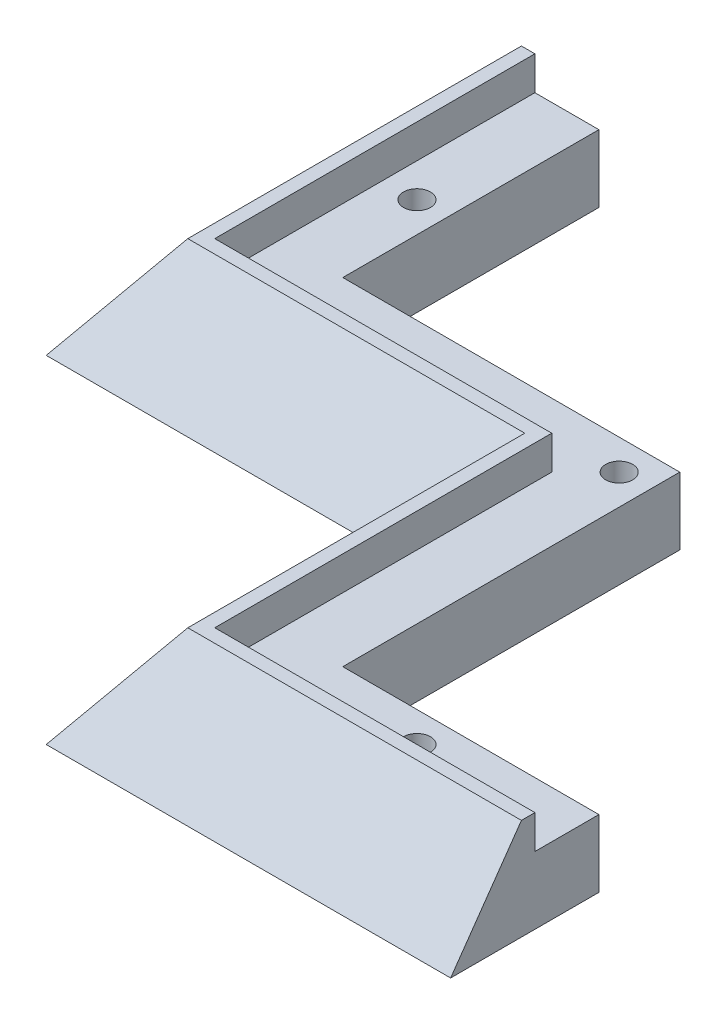
ISO-10303-21;
HEADER;
FILE_DESCRIPTION(('STEP AP214'),'2;1');
FILE_NAME('part.step','',(''),(''),'','','');
FILE_SCHEMA(('AUTOMOTIVE_DESIGN { 1 0 10303 214 1 1 1 1 }'));
ENDSEC;
DATA;
#1=APPLICATION_CONTEXT('core data for automotive mechanical design processes');
#2=APPLICATION_PROTOCOL_DEFINITION('international standard','automotive_design',2000,#1);
#3=PRODUCT_CONTEXT('',#1,'mechanical');
#4=PRODUCT('Part','Part','',(#3));
#5=PRODUCT_RELATED_PRODUCT_CATEGORY('part','',(#4));
#6=PRODUCT_DEFINITION_FORMATION('','',#4);
#7=PRODUCT_DEFINITION_CONTEXT('part definition',#1,'design');
#8=PRODUCT_DEFINITION('design','',#6,#7);
#9=PRODUCT_DEFINITION_SHAPE('','',#8);
#10=(LENGTH_UNIT() NAMED_UNIT(*) SI_UNIT(.MILLI.,.METRE.));
#11=(NAMED_UNIT(*) PLANE_ANGLE_UNIT() SI_UNIT($,.RADIAN.));
#12=(NAMED_UNIT(*) SI_UNIT($,.STERADIAN.) SOLID_ANGLE_UNIT());
#13=UNCERTAINTY_MEASURE_WITH_UNIT(LENGTH_MEASURE(1.E-05),#10,'distance_accuracy_value','');
#14=(GEOMETRIC_REPRESENTATION_CONTEXT(3) GLOBAL_UNCERTAINTY_ASSIGNED_CONTEXT((#13)) GLOBAL_UNIT_ASSIGNED_CONTEXT((#10,
#11,#12)) REPRESENTATION_CONTEXT('',''));
#15=CARTESIAN_POINT('',(0.,0.,0.));
#16=DIRECTION('',(0.,0.,1.));
#17=DIRECTION('',(1.,0.,0.));
#18=AXIS2_PLACEMENT_3D('',#15,#16,#17);
#19=CARTESIAN_POINT('',(68.6476510887299,15.,68.6476510887299));
#20=DIRECTION('',(-1.,0.,0.));
#21=DIRECTION('',(0.,0.,1.));
#22=AXIS2_PLACEMENT_3D('',#19,#20,#21);
#23=PLANE('',#22);
#24=DIRECTION('',(0.,0.,-1.));
#25=VECTOR('',#24,1.);
#26=CARTESIAN_POINT('',(68.6476510887299,10.,46.6476510887299));
#27=LINE('',#26,#25);
#28=CARTESIAN_POINT('',(68.6476510887299,10.,56.1403822311179));
#29=VERTEX_POINT('',#28);
#30=CARTESIAN_POINT('',(68.6476510887299,10.,46.6476510887299));
#31=VERTEX_POINT('',#30);
#32=EDGE_CURVE('E178',#29,#31,#27,.T.);
#33=ORIENTED_EDGE('',*,*,#32,.F.);
#34=DIRECTION('',(0.,1.,0.));
#35=VECTOR('',#34,1.);
#36=CARTESIAN_POINT('',(68.6476510887299,10.,56.1403822311179));
#37=LINE('',#36,#35);
#38=CARTESIAN_POINT('',(68.6476510887299,15.,56.1403822311179));
#39=VERTEX_POINT('',#38);
#40=EDGE_CURVE('E198',#29,#39,#37,.T.);
#41=ORIENTED_EDGE('',*,*,#40,.T.);
#42=DIRECTION('',(0.,0.,-1.));
#43=VECTOR('',#42,1.);
#44=CARTESIAN_POINT('',(68.6476510887299,15.,68.6476510887299));
#45=LINE('',#44,#43);
#46=CARTESIAN_POINT('',(68.6476510887299,15.,58.1445380155843));
#47=VERTEX_POINT('',#46);
#48=EDGE_CURVE('E222',#47,#39,#45,.T.);
#49=ORIENTED_EDGE('',*,*,#48,.F.);
#50=DIRECTION('',(0.,-0.819152044288993,0.573576436351045));
#51=VECTOR('',#50,1.);
#52=CARTESIAN_POINT('',(68.6476510887299,15.,58.1445380155843));
#53=LINE('',#52,#51);
#54=CARTESIAN_POINT('',(68.6476510887299,0.,68.6476510887299));
#55=VERTEX_POINT('',#54);
#56=EDGE_CURVE('E45',#47,#55,#53,.T.);
#57=ORIENTED_EDGE('',*,*,#56,.T.);
#58=DIRECTION('',(0.,0.,-1.));
#59=VECTOR('',#58,1.);
#60=CARTESIAN_POINT('',(68.6476510887299,0.,68.6476510887299));
#61=LINE('',#60,#59);
#62=CARTESIAN_POINT('',(68.6476510887299,0.,46.6476510887299));
#63=VERTEX_POINT('',#62);
#64=EDGE_CURVE('E241',#55,#63,#61,.T.);
#65=ORIENTED_EDGE('',*,*,#64,.T.);
#66=DIRECTION('',(0.,-1.,0.));
#67=VECTOR('',#66,1.);
#68=CARTESIAN_POINT('',(68.6476510887299,15.,46.6476510887299));
#69=LINE('',#68,#67);
#70=EDGE_CURVE('E264',#31,#63,#69,.T.);
#71=ORIENTED_EDGE('',*,*,#70,.F.);
#72=EDGE_LOOP('',(#33,#41,#49,#57,#65,#71));
#73=FACE_BOUND('',#72,.T.);
#74=ADVANCED_FACE('F35',(#73),#23,.F.);
#75=CARTESIAN_POINT('',(30.6476510887299,15.,46.6476510887299));
#76=DIRECTION('',(0.,0.,1.));
#77=DIRECTION('',(1.,0.,0.));
#78=AXIS2_PLACEMENT_3D('',#75,#76,#77);
#79=PLANE('',#78);
#80=DIRECTION('',(0.,-1.,0.));
#81=VECTOR('',#80,1.);
#82=CARTESIAN_POINT('',(30.6476510887299,15.,46.6476510887299));
#83=LINE('',#82,#81);
#84=CARTESIAN_POINT('',(30.6476510887299,10.,46.6476510887299));
#85=VERTEX_POINT('',#84);
#86=CARTESIAN_POINT('',(30.6476510887299,0.,46.6476510887299));
#87=VERTEX_POINT('',#86);
#88=EDGE_CURVE('E262',#85,#87,#83,.T.);
#89=ORIENTED_EDGE('',*,*,#88,.F.);
#90=DIRECTION('',(-1.,0.,0.));
#91=VECTOR('',#90,1.);
#92=CARTESIAN_POINT('',(30.6476510887299,10.,46.6476510887299));
#93=LINE('',#92,#91);
#94=EDGE_CURVE('E180',#31,#85,#93,.T.);
#95=ORIENTED_EDGE('',*,*,#94,.F.);
#96=ORIENTED_EDGE('',*,*,#70,.T.);
#97=DIRECTION('',(-1.,0.,0.));
#98=VECTOR('',#97,1.);
#99=CARTESIAN_POINT('',(30.6476510887299,0.,46.6476510887299));
#100=LINE('',#99,#98);
#101=EDGE_CURVE('E244',#63,#87,#100,.T.);
#102=ORIENTED_EDGE('',*,*,#101,.T.);
#103=EDGE_LOOP('',(#89,#95,#96,#102));
#104=FACE_BOUND('',#103,.T.);
#105=ADVANCED_FACE('F330',(#104),#79,.F.);
#106=CARTESIAN_POINT('',(30.6476510887299,15.,-3.3523489112701));
#107=DIRECTION('',(-1.,0.,0.));
#108=DIRECTION('',(0.,0.,1.));
#109=AXIS2_PLACEMENT_3D('',#106,#107,#108);
#110=PLANE('',#109);
#111=DIRECTION('',(0.,-1.,0.));
#112=VECTOR('',#111,1.);
#113=CARTESIAN_POINT('',(30.6476510887299,15.,-3.3523489112701));
#114=LINE('',#113,#112);
#115=CARTESIAN_POINT('',(30.6476510887299,10.,-3.3523489112701));
#116=VERTEX_POINT('',#115);
#117=CARTESIAN_POINT('',(30.6476510887299,0.,-3.3523489112701));
#118=VERTEX_POINT('',#117);
#119=EDGE_CURVE('E260',#116,#118,#114,.T.);
#120=ORIENTED_EDGE('',*,*,#119,.F.);
#121=DIRECTION('',(0.,0.,-1.));
#122=VECTOR('',#121,1.);
#123=CARTESIAN_POINT('',(30.6476510887299,10.,-3.3523489112701));
#124=LINE('',#123,#122);
#125=EDGE_CURVE('E182',#85,#116,#124,.T.);
#126=ORIENTED_EDGE('',*,*,#125,.F.);
#127=ORIENTED_EDGE('',*,*,#88,.T.);
#128=DIRECTION('',(0.,0.,-1.));
#129=VECTOR('',#128,1.);
#130=CARTESIAN_POINT('',(30.6476510887299,0.,-3.3523489112701));
#131=LINE('',#130,#129);
#132=EDGE_CURVE('E247',#87,#118,#131,.T.);
#133=ORIENTED_EDGE('',*,*,#132,.T.);
#134=EDGE_LOOP('',(#120,#126,#127,#133));
#135=FACE_BOUND('',#134,.T.);
#136=ADVANCED_FACE('F327',(#135),#110,.F.);
#137=CARTESIAN_POINT('',(-19.3523489112701,15.,-3.3523489112701));
#138=DIRECTION('',(0.,0.,1.));
#139=DIRECTION('',(1.,0.,0.));
#140=AXIS2_PLACEMENT_3D('',#137,#138,#139);
#141=PLANE('',#140);
#142=DIRECTION('',(0.,-1.,0.));
#143=VECTOR('',#142,1.);
#144=CARTESIAN_POINT('',(-19.3523489112701,15.,-3.3523489112701));
#145=LINE('',#144,#143);
#146=CARTESIAN_POINT('',(-19.3523489112701,10.,-3.3523489112701));
#147=VERTEX_POINT('',#146);
#148=CARTESIAN_POINT('',(-19.3523489112701,0.,-3.3523489112701));
#149=VERTEX_POINT('',#148);
#150=EDGE_CURVE('E258',#147,#149,#145,.T.);
#151=ORIENTED_EDGE('',*,*,#150,.F.);
#152=DIRECTION('',(-1.,0.,0.));
#153=VECTOR('',#152,1.);
#154=CARTESIAN_POINT('',(-19.3523489112701,10.,-3.3523489112701));
#155=LINE('',#154,#153);
#156=EDGE_CURVE('E184',#116,#147,#155,.T.);
#157=ORIENTED_EDGE('',*,*,#156,.F.);
#158=ORIENTED_EDGE('',*,*,#119,.T.);
#159=DIRECTION('',(-1.,0.,0.));
#160=VECTOR('',#159,1.);
#161=CARTESIAN_POINT('',(-19.3523489112701,0.,-3.3523489112701));
#162=LINE('',#161,#160);
#163=EDGE_CURVE('E250',#118,#149,#162,.T.);
#164=ORIENTED_EDGE('',*,*,#163,.T.);
#165=EDGE_LOOP('',(#151,#157,#158,#164));
#166=FACE_BOUND('',#165,.T.);
#167=ADVANCED_FACE('F322',(#166),#141,.F.);
#168=CARTESIAN_POINT('',(-19.3523489112701,15.,-41.3523489112701));
#169=DIRECTION('',(-1.,0.,0.));
#170=DIRECTION('',(0.,0.,1.));
#171=AXIS2_PLACEMENT_3D('',#168,#169,#170);
#172=PLANE('',#171);
#173=DIRECTION('',(0.,-1.,0.));
#174=VECTOR('',#173,1.);
#175=CARTESIAN_POINT('',(-19.3523489112701,15.,-41.3523489112701));
#176=LINE('',#175,#174);
#177=CARTESIAN_POINT('',(-19.3523489112701,10.,-41.3523489112701));
#178=VERTEX_POINT('',#177);
#179=CARTESIAN_POINT('',(-19.3523489112701,0.,-41.3523489112701));
#180=VERTEX_POINT('',#179);
#181=EDGE_CURVE('E228',#178,#180,#176,.T.);
#182=ORIENTED_EDGE('',*,*,#181,.F.);
#183=DIRECTION('',(0.,0.,-1.));
#184=VECTOR('',#183,1.);
#185=CARTESIAN_POINT('',(-19.3523489112701,10.,-41.3523489112701));
#186=LINE('',#185,#184);
#187=EDGE_CURVE('E186',#147,#178,#186,.T.);
#188=ORIENTED_EDGE('',*,*,#187,.F.);
#189=ORIENTED_EDGE('',*,*,#150,.T.);
#190=DIRECTION('',(0.,0.,-1.));
#191=VECTOR('',#190,1.);
#192=CARTESIAN_POINT('',(-19.3523489112701,0.,-41.3523489112701));
#193=LINE('',#192,#191);
#194=EDGE_CURVE('E253',#149,#180,#193,.T.);
#195=ORIENTED_EDGE('',*,*,#194,.T.);
#196=EDGE_LOOP('',(#182,#188,#189,#195));
#197=FACE_BOUND('',#196,.T.);
#198=ADVANCED_FACE('F316',(#197),#172,.F.);
#199=CARTESIAN_POINT('',(-19.3523489112701,15.,-41.3523489112701));
#200=DIRECTION('',(0.,0.,1.));
#201=DIRECTION('',(1.,0.,0.));
#202=AXIS2_PLACEMENT_3D('',#199,#200,#201);
#203=PLANE('',#202);
#204=DIRECTION('',(-1.,0.,0.));
#205=VECTOR('',#204,1.);
#206=CARTESIAN_POINT('',(-19.3523489112701,15.,-41.3523489112701));
#207=LINE('',#206,#205);
#208=CARTESIAN_POINT('',(-28.8492358381245,15.,-41.3523489112701));
#209=VERTEX_POINT('',#208);
#210=CARTESIAN_POINT('',(-30.8492358381245,15.,-41.3523489112701));
#211=VERTEX_POINT('',#210);
#212=EDGE_CURVE('E225',#209,#211,#207,.T.);
#213=ORIENTED_EDGE('',*,*,#212,.F.);
#214=DIRECTION('',(0.,1.,0.));
#215=VECTOR('',#214,1.);
#216=CARTESIAN_POINT('',(-28.8492358381245,10.,-41.3523489112701));
#217=LINE('',#216,#215);
#218=CARTESIAN_POINT('',(-28.8492358381245,10.,-41.3523489112701));
#219=VERTEX_POINT('',#218);
#220=EDGE_CURVE('E195',#219,#209,#217,.T.);
#221=ORIENTED_EDGE('',*,*,#220,.F.);
#222=DIRECTION('',(-1.,0.,0.));
#223=VECTOR('',#222,1.);
#224=CARTESIAN_POINT('',(-28.8492358381245,10.,-41.3523489112701));
#225=LINE('',#224,#223);
#226=EDGE_CURVE('E153',#178,#219,#225,.T.);
#227=ORIENTED_EDGE('',*,*,#226,.F.);
#228=ORIENTED_EDGE('',*,*,#181,.T.);
#229=DIRECTION('',(-1.,0.,0.));
#230=VECTOR('',#229,1.);
#231=CARTESIAN_POINT('',(-19.3523489112701,0.,-41.3523489112701));
#232=LINE('',#231,#230);
#233=CARTESIAN_POINT('',(-41.3523489112701,0.,-41.3523489112701));
#234=VERTEX_POINT('',#233);
#235=EDGE_CURVE('E226',#180,#234,#232,.T.);
#236=ORIENTED_EDGE('',*,*,#235,.T.);
#237=DIRECTION('',(0.573576436351045,0.819152044288993,0.));
#238=VECTOR('',#237,1.);
#239=CARTESIAN_POINT('',(-30.8492358381245,15.,-41.3523489112701));
#240=LINE('',#239,#238);
#241=EDGE_CURVE('E11',#234,#211,#240,.T.);
#242=ORIENTED_EDGE('',*,*,#241,.T.);
#243=EDGE_LOOP('',(#213,#221,#227,#228,#236,#242));
#244=FACE_BOUND('',#243,.T.);
#245=ADVANCED_FACE('F312',(#244),#203,.F.);
#246=CARTESIAN_POINT('',(0.,15.,0.));
#247=DIRECTION('',(0.,1.,0.));
#248=DIRECTION('',(0.,0.,1.));
#249=AXIS2_PLACEMENT_3D('',#246,#247,#248);
#250=PLANE('',#249);
#251=DIRECTION('',(0.,0.,1.));
#252=VECTOR('',#251,1.);
#253=CARTESIAN_POINT('',(-28.8492358381245,15.,6.14453801558427));
#254=LINE('',#253,#252);
#255=CARTESIAN_POINT('',(-28.8492358381245,15.,6.14453801558427));
#256=VERTEX_POINT('',#255);
#257=EDGE_CURVE('E53',#209,#256,#254,.T.);
#258=ORIENTED_EDGE('',*,*,#257,.F.);
#259=ORIENTED_EDGE('',*,*,#212,.T.);
#260=DIRECTION('',(0.,0.,1.));
#261=VECTOR('',#260,1.);
#262=CARTESIAN_POINT('',(-30.8492358381245,15.,18.6476510887299));
#263=LINE('',#262,#261);
#264=CARTESIAN_POINT('',(-30.8492358381245,15.,8.14453801558427));
#265=VERTEX_POINT('',#264);
#266=EDGE_CURVE('E266',#211,#265,#263,.T.);
#267=ORIENTED_EDGE('',*,*,#266,.T.);
#268=DIRECTION('',(1.,0.,0.));
#269=VECTOR('',#268,1.);
#270=CARTESIAN_POINT('',(8.6476510887299,15.,8.14453801558427));
#271=LINE('',#270,#269);
#272=CARTESIAN_POINT('',(19.1507641618755,15.,8.14453801558427));
#273=VERTEX_POINT('',#272);
#274=EDGE_CURVE('E268',#265,#273,#271,.T.);
#275=ORIENTED_EDGE('',*,*,#274,.T.);
#276=DIRECTION('',(0.,0.,1.));
#277=VECTOR('',#276,1.);
#278=CARTESIAN_POINT('',(19.1507641618755,15.,68.6476510887299));
#279=LINE('',#278,#277);
#280=CARTESIAN_POINT('',(19.1507641618755,15.,58.1445380155843));
#281=VERTEX_POINT('',#280);
#282=EDGE_CURVE('E61',#273,#281,#279,.T.);
#283=ORIENTED_EDGE('',*,*,#282,.T.);
#284=DIRECTION('',(1.,0.,0.));
#285=VECTOR('',#284,1.);
#286=CARTESIAN_POINT('',(68.6476510887299,15.,58.1445380155843));
#287=LINE('',#286,#285);
#288=EDGE_CURVE('E271',#281,#47,#287,.T.);
#289=ORIENTED_EDGE('',*,*,#288,.T.);
#290=ORIENTED_EDGE('',*,*,#48,.T.);
#291=DIRECTION('',(1.,0.,0.));
#292=VECTOR('',#291,1.);
#293=CARTESIAN_POINT('',(68.6476510887299,15.,56.1403822311179));
#294=LINE('',#293,#292);
#295=CARTESIAN_POINT('',(21.1507641618755,15.,56.1403822311179));
#296=VERTEX_POINT('',#295);
#297=EDGE_CURVE('E166',#296,#39,#294,.T.);
#298=ORIENTED_EDGE('',*,*,#297,.F.);
#299=DIRECTION('',(0.,0.,1.));
#300=VECTOR('',#299,1.);
#301=CARTESIAN_POINT('',(21.1507641618755,15.,56.1403822311179));
#302=LINE('',#301,#300);
#303=CARTESIAN_POINT('',(21.1507641618755,15.,6.14453801558427));
#304=VERTEX_POINT('',#303);
#305=EDGE_CURVE('E168',#304,#296,#302,.T.);
#306=ORIENTED_EDGE('',*,*,#305,.F.);
#307=DIRECTION('',(1.,0.,0.));
#308=VECTOR('',#307,1.);
#309=CARTESIAN_POINT('',(21.1507641618755,15.,6.14453801558427));
#310=LINE('',#309,#308);
#311=EDGE_CURVE('E190',#256,#304,#310,.T.);
#312=ORIENTED_EDGE('',*,*,#311,.F.);
#313=EDGE_LOOP('',(#258,#259,#267,#275,#283,#289,#290,#298,#306,#312));
#314=FACE_BOUND('',#313,.T.);
#315=ADVANCED_FACE('F298',(#314),#250,.T.);
#316=CARTESIAN_POINT('',(0.,0.,0.));
#317=DIRECTION('',(0.,1.,0.));
#318=DIRECTION('',(0.,0.,1.));
#319=AXIS2_PLACEMENT_3D('',#316,#317,#318);
#320=PLANE('',#319);
#321=CARTESIAN_POINT('',(38.6476510887299,0.,63.6476510887299));
#322=DIRECTION('',(0.,-1.,0.));
#323=DIRECTION('',(0.,0.,-1.));
#324=AXIS2_PLACEMENT_3D('',#321,#322,#323);
#325=CIRCLE('',#324,2.);
#326=CARTESIAN_POINT('',(38.6476510887299,0.,61.6476510887299));
#327=VERTEX_POINT('',#326);
#328=EDGE_CURVE('E208',#327,#327,#325,.T.);
#329=ORIENTED_EDGE('',*,*,#328,.F.);
#330=EDGE_LOOP('',(#329));
#331=FACE_BOUND('',#330,.T.);
#332=CARTESIAN_POINT('',(13.6476510887299,0.,38.6476510887299));
#333=DIRECTION('',(0.,-1.,0.));
#334=DIRECTION('',(0.,0.,-1.));
#335=AXIS2_PLACEMENT_3D('',#332,#333,#334);
#336=CIRCLE('',#335,2.);
#337=CARTESIAN_POINT('',(13.6476510887299,0.,36.6476510887299));
#338=VERTEX_POINT('',#337);
#339=EDGE_CURVE('E214',#338,#338,#336,.T.);
#340=ORIENTED_EDGE('',*,*,#339,.F.);
#341=EDGE_LOOP('',(#340));
#342=FACE_BOUND('',#341,.T.);
#343=CARTESIAN_POINT('',(-11.3523489112701,0.,13.6476510887299));
#344=DIRECTION('',(0.,-1.,0.));
#345=DIRECTION('',(0.,0.,-1.));
#346=AXIS2_PLACEMENT_3D('',#343,#344,#345);
#347=CIRCLE('',#346,2.);
#348=CARTESIAN_POINT('',(-11.3523489112701,0.,11.6476510887299));
#349=VERTEX_POINT('',#348);
#350=EDGE_CURVE('E197',#349,#349,#347,.T.);
#351=ORIENTED_EDGE('',*,*,#350,.F.);
#352=EDGE_LOOP('',(#351));
#353=FACE_BOUND('',#352,.T.);
#354=DIRECTION('',(0.,0.,1.));
#355=VECTOR('',#354,1.);
#356=CARTESIAN_POINT('',(-41.3523489112701,0.,18.6476510887299));
#357=LINE('',#356,#355);
#358=CARTESIAN_POINT('',(-41.3523489112701,0.,18.6476510887299));
#359=VERTEX_POINT('',#358);
#360=EDGE_CURVE('E229',#234,#359,#357,.T.);
#361=ORIENTED_EDGE('',*,*,#360,.F.);
#362=ORIENTED_EDGE('',*,*,#235,.F.);
#363=ORIENTED_EDGE('',*,*,#194,.F.);
#364=ORIENTED_EDGE('',*,*,#163,.F.);
#365=ORIENTED_EDGE('',*,*,#132,.F.);
#366=ORIENTED_EDGE('',*,*,#101,.F.);
#367=ORIENTED_EDGE('',*,*,#64,.F.);
#368=DIRECTION('',(1.,0.,0.));
#369=VECTOR('',#368,1.);
#370=CARTESIAN_POINT('',(68.6476510887299,0.,68.6476510887299));
#371=LINE('',#370,#369);
#372=CARTESIAN_POINT('',(8.64765108872991,0.,68.6476510887299));
#373=VERTEX_POINT('',#372);
#374=EDGE_CURVE('E238',#373,#55,#371,.T.);
#375=ORIENTED_EDGE('',*,*,#374,.F.);
#376=DIRECTION('',(0.,0.,1.));
#377=VECTOR('',#376,1.);
#378=CARTESIAN_POINT('',(8.6476510887299,0.,18.6476510887299));
#379=LINE('',#378,#377);
#380=CARTESIAN_POINT('',(8.6476510887299,0.,18.6476510887299));
#381=VERTEX_POINT('',#380);
#382=EDGE_CURVE('E235',#381,#373,#379,.T.);
#383=ORIENTED_EDGE('',*,*,#382,.F.);
#384=DIRECTION('',(1.,0.,0.));
#385=VECTOR('',#384,1.);
#386=CARTESIAN_POINT('',(-41.3523489112701,0.,18.6476510887299));
#387=LINE('',#386,#385);
#388=EDGE_CURVE('E232',#359,#381,#387,.T.);
#389=ORIENTED_EDGE('',*,*,#388,.F.);
#390=EDGE_LOOP('',(#361,#362,#363,#364,#365,#366,#367,#375,#383,#389));
#391=FACE_BOUND('',#390,.T.);
#392=ADVANCED_FACE('F290',(#331,#342,#353,#391),#320,.F.);
#393=CARTESIAN_POINT('',(-30.8492358381245,15.,0.));
#394=DIRECTION('',(-0.819152044288993,0.573576436351045,0.));
#395=DIRECTION('',(0.,0.,-1.));
#396=AXIS2_PLACEMENT_3D('',#393,#394,#395);
#397=PLANE('',#396);
#398=ORIENTED_EDGE('',*,*,#241,.F.);
#399=ORIENTED_EDGE('',*,*,#360,.T.);
#400=DIRECTION('',(0.497542812164522,0.710564775461631,-0.497542812164522));
#401=VECTOR('',#400,1.);
#402=CARTESIAN_POINT('',(-28.8330648191018,17.8793906220684,6.12836699656162));
#403=LINE('',#402,#401);
#404=EDGE_CURVE('E40',#265,#359,#403,.F.);
#405=ORIENTED_EDGE('',*,*,#404,.F.);
#406=ORIENTED_EDGE('',*,*,#266,.F.);
#407=EDGE_LOOP('',(#398,#399,#405,#406));
#408=FACE_BOUND('',#407,.T.);
#409=ADVANCED_FACE('F38',(#408),#397,.T.);
#410=CARTESIAN_POINT('',(0.,15.,8.14453801558427));
#411=DIRECTION('',(0.,0.573576436351045,0.819152044288993));
#412=DIRECTION('',(-1.,0.,0.));
#413=AXIS2_PLACEMENT_3D('',#410,#411,#412);
#414=PLANE('',#413);
#415=ORIENTED_EDGE('',*,*,#404,.T.);
#416=ORIENTED_EDGE('',*,*,#388,.T.);
#417=DIRECTION('',(0.497542812164522,0.710564775461631,-0.497542812164522));
#418=VECTOR('',#417,1.);
#419=CARTESIAN_POINT('',(21.1669351808982,17.8793906220684,6.12836699656162));
#420=LINE('',#419,#418);
#421=EDGE_CURVE('E275',#273,#381,#420,.F.);
#422=ORIENTED_EDGE('',*,*,#421,.F.);
#423=ORIENTED_EDGE('',*,*,#274,.F.);
#424=EDGE_LOOP('',(#415,#416,#422,#423));
#425=FACE_BOUND('',#424,.T.);
#426=ADVANCED_FACE('F283',(#425),#414,.T.);
#427=CARTESIAN_POINT('',(19.1507641618755,15.,0.));
#428=DIRECTION('',(-0.819152044288993,0.573576436351045,0.));
#429=DIRECTION('',(0.,0.,-1.));
#430=AXIS2_PLACEMENT_3D('',#427,#428,#429);
#431=PLANE('',#430);
#432=ORIENTED_EDGE('',*,*,#421,.T.);
#433=ORIENTED_EDGE('',*,*,#382,.T.);
#434=DIRECTION('',(0.497542812164522,0.710564775461631,-0.497542812164522));
#435=VECTOR('',#434,1.);
#436=CARTESIAN_POINT('',(33.5443776777272,35.55621045248,43.7509244997326));
#437=LINE('',#436,#435);
#438=EDGE_CURVE('E207',#281,#373,#437,.F.);
#439=ORIENTED_EDGE('',*,*,#438,.F.);
#440=ORIENTED_EDGE('',*,*,#282,.F.);
#441=EDGE_LOOP('',(#432,#433,#439,#440));
#442=FACE_BOUND('',#441,.T.);
#443=ADVANCED_FACE('F293',(#442),#431,.T.);
#444=CARTESIAN_POINT('',(0.,15.,58.1445380155843));
#445=DIRECTION('',(0.,0.573576436351045,0.819152044288993));
#446=DIRECTION('',(-1.,0.,0.));
#447=AXIS2_PLACEMENT_3D('',#444,#445,#446);
#448=PLANE('',#447);
#449=ORIENTED_EDGE('',*,*,#438,.T.);
#450=ORIENTED_EDGE('',*,*,#374,.T.);
#451=ORIENTED_EDGE('',*,*,#56,.F.);
#452=ORIENTED_EDGE('',*,*,#288,.F.);
#453=EDGE_LOOP('',(#449,#450,#451,#452));
#454=FACE_BOUND('',#453,.T.);
#455=ADVANCED_FACE('F296',(#454),#448,.T.);
#456=CARTESIAN_POINT('',(-11.3523489112701,4.,13.6476510887299));
#457=DIRECTION('',(0.,-1.,0.));
#458=DIRECTION('',(0.,0.,-1.));
#459=AXIS2_PLACEMENT_3D('',#456,#457,#458);
#460=CYLINDRICAL_SURFACE('',#459,2.);
#461=CARTESIAN_POINT('',(-11.3523489112701,4.,13.6476510887299));
#462=DIRECTION('',(0.,-1.,0.));
#463=DIRECTION('',(0.,0.,-1.));
#464=AXIS2_PLACEMENT_3D('',#461,#462,#463);
#465=CIRCLE('',#464,2.);
#466=CARTESIAN_POINT('',(-11.3523489112701,4.,11.6476510887299));
#467=VERTEX_POINT('',#466);
#468=EDGE_CURVE('E217',#467,#467,#465,.T.);
#469=ORIENTED_EDGE('',*,*,#468,.F.);
#470=EDGE_LOOP('',(#469));
#471=FACE_BOUND('',#470,.T.);
#472=ORIENTED_EDGE('',*,*,#350,.T.);
#473=EDGE_LOOP('',(#472));
#474=FACE_BOUND('',#473,.T.);
#475=ADVANCED_FACE('F347',(#471,#474),#460,.F.);
#476=CARTESIAN_POINT('',(-11.3523489112701,4.,13.6476510887299));
#477=DIRECTION('',(0.,-1.,0.));
#478=DIRECTION('',(0.,0.,-1.));
#479=AXIS2_PLACEMENT_3D('',#476,#477,#478);
#480=PLANE('',#479);
#481=ORIENTED_EDGE('',*,*,#468,.T.);
#482=EDGE_LOOP('',(#481));
#483=FACE_BOUND('',#482,.T.);
#484=ADVANCED_FACE('F515',(#483),#480,.T.);
#485=CARTESIAN_POINT('',(13.6476510887299,4.,38.6476510887299));
#486=DIRECTION('',(0.,-1.,0.));
#487=DIRECTION('',(0.,0.,-1.));
#488=AXIS2_PLACEMENT_3D('',#485,#486,#487);
#489=CYLINDRICAL_SURFACE('',#488,2.);
#490=CARTESIAN_POINT('',(13.6476510887299,4.,38.6476510887299));
#491=DIRECTION('',(0.,-1.,0.));
#492=DIRECTION('',(0.,0.,-1.));
#493=AXIS2_PLACEMENT_3D('',#490,#491,#492);
#494=CIRCLE('',#493,2.);
#495=CARTESIAN_POINT('',(13.6476510887299,4.,36.6476510887299));
#496=VERTEX_POINT('',#495);
#497=EDGE_CURVE('E211',#496,#496,#494,.T.);
#498=ORIENTED_EDGE('',*,*,#497,.F.);
#499=EDGE_LOOP('',(#498));
#500=FACE_BOUND('',#499,.T.);
#501=ORIENTED_EDGE('',*,*,#339,.T.);
#502=EDGE_LOOP('',(#501));
#503=FACE_BOUND('',#502,.T.);
#504=ADVANCED_FACE('F511',(#500,#503),#489,.F.);
#505=CARTESIAN_POINT('',(13.6476510887299,4.,38.6476510887299));
#506=DIRECTION('',(0.,-1.,0.));
#507=DIRECTION('',(0.,0.,-1.));
#508=AXIS2_PLACEMENT_3D('',#505,#506,#507);
#509=PLANE('',#508);
#510=ORIENTED_EDGE('',*,*,#497,.T.);
#511=EDGE_LOOP('',(#510));
#512=FACE_BOUND('',#511,.T.);
#513=ADVANCED_FACE('F507',(#512),#509,.T.);
#514=CARTESIAN_POINT('',(38.6476510887299,4.,63.6476510887299));
#515=DIRECTION('',(0.,-1.,0.));
#516=DIRECTION('',(0.,0.,-1.));
#517=AXIS2_PLACEMENT_3D('',#514,#515,#516);
#518=CYLINDRICAL_SURFACE('',#517,2.);
#519=CARTESIAN_POINT('',(38.6476510887299,4.,63.6476510887299));
#520=DIRECTION('',(0.,-1.,0.));
#521=DIRECTION('',(0.,0.,-1.));
#522=AXIS2_PLACEMENT_3D('',#519,#520,#521);
#523=CIRCLE('',#522,2.);
#524=CARTESIAN_POINT('',(38.6476510887299,4.,61.6476510887299));
#525=VERTEX_POINT('',#524);
#526=EDGE_CURVE('E204',#525,#525,#523,.T.);
#527=ORIENTED_EDGE('',*,*,#526,.F.);
#528=EDGE_LOOP('',(#527));
#529=FACE_BOUND('',#528,.T.);
#530=ORIENTED_EDGE('',*,*,#328,.T.);
#531=EDGE_LOOP('',(#530));
#532=FACE_BOUND('',#531,.T.);
#533=ADVANCED_FACE('F503',(#529,#532),#518,.F.);
#534=CARTESIAN_POINT('',(38.6476510887299,4.,63.6476510887299));
#535=DIRECTION('',(0.,-1.,0.));
#536=DIRECTION('',(0.,0.,-1.));
#537=AXIS2_PLACEMENT_3D('',#534,#535,#536);
#538=PLANE('',#537);
#539=ORIENTED_EDGE('',*,*,#526,.T.);
#540=EDGE_LOOP('',(#539));
#541=FACE_BOUND('',#540,.T.);
#542=ADVANCED_FACE('F401',(#541),#538,.T.);
#543=CARTESIAN_POINT('',(-28.8492358381245,10.,6.14453801558427));
#544=DIRECTION('',(-1.,0.,0.));
#545=DIRECTION('',(0.,0.,1.));
#546=AXIS2_PLACEMENT_3D('',#543,#544,#545);
#547=PLANE('',#546);
#548=ORIENTED_EDGE('',*,*,#257,.T.);
#549=DIRECTION('',(0.,1.,0.));
#550=VECTOR('',#549,1.);
#551=CARTESIAN_POINT('',(-28.8492358381245,10.,6.14453801558427));
#552=LINE('',#551,#550);
#553=CARTESIAN_POINT('',(-28.8492358381245,10.,6.14453801558427));
#554=VERTEX_POINT('',#553);
#555=EDGE_CURVE('E143',#554,#256,#552,.T.);
#556=ORIENTED_EDGE('',*,*,#555,.F.);
#557=DIRECTION('',(0.,0.,1.));
#558=VECTOR('',#557,1.);
#559=CARTESIAN_POINT('',(-28.8492358381245,10.,6.14453801558427));
#560=LINE('',#559,#558);
#561=EDGE_CURVE('E147',#219,#554,#560,.T.);
#562=ORIENTED_EDGE('',*,*,#561,.F.);
#563=ORIENTED_EDGE('',*,*,#220,.T.);
#564=EDGE_LOOP('',(#548,#556,#562,#563));
#565=FACE_BOUND('',#564,.T.);
#566=ADVANCED_FACE('F145',(#565),#547,.F.);
#567=CARTESIAN_POINT('',(68.6476510887299,10.,56.1403822311179));
#568=DIRECTION('',(0.,0.,1.));
#569=DIRECTION('',(1.,0.,0.));
#570=AXIS2_PLACEMENT_3D('',#567,#568,#569);
#571=PLANE('',#570);
#572=ORIENTED_EDGE('',*,*,#297,.T.);
#573=ORIENTED_EDGE('',*,*,#40,.F.);
#574=DIRECTION('',(1.,0.,0.));
#575=VECTOR('',#574,1.);
#576=CARTESIAN_POINT('',(68.6476510887299,10.,56.1403822311179));
#577=LINE('',#576,#575);
#578=CARTESIAN_POINT('',(21.1507641618755,10.,56.1403822311179));
#579=VERTEX_POINT('',#578);
#580=EDGE_CURVE('E175',#579,#29,#577,.T.);
#581=ORIENTED_EDGE('',*,*,#580,.F.);
#582=DIRECTION('',(0.,1.,0.));
#583=VECTOR('',#582,1.);
#584=CARTESIAN_POINT('',(21.1507641618755,10.,56.1403822311179));
#585=LINE('',#584,#583);
#586=EDGE_CURVE('E201',#579,#296,#585,.T.);
#587=ORIENTED_EDGE('',*,*,#586,.T.);
#588=EDGE_LOOP('',(#572,#573,#581,#587));
#589=FACE_BOUND('',#588,.T.);
#590=ADVANCED_FACE('F305',(#589),#571,.F.);
#591=CARTESIAN_POINT('',(21.1507641618755,10.,56.1403822311179));
#592=DIRECTION('',(-1.,0.,0.));
#593=DIRECTION('',(0.,0.,1.));
#594=AXIS2_PLACEMENT_3D('',#591,#592,#593);
#595=PLANE('',#594);
#596=ORIENTED_EDGE('',*,*,#305,.T.);
#597=ORIENTED_EDGE('',*,*,#586,.F.);
#598=DIRECTION('',(0.,0.,1.));
#599=VECTOR('',#598,1.);
#600=CARTESIAN_POINT('',(21.1507641618755,10.,56.1403822311179));
#601=LINE('',#600,#599);
#602=CARTESIAN_POINT('',(21.1507641618755,10.,6.14453801558427));
#603=VERTEX_POINT('',#602);
#604=EDGE_CURVE('E161',#603,#579,#601,.T.);
#605=ORIENTED_EDGE('',*,*,#604,.F.);
#606=DIRECTION('',(0.,1.,0.));
#607=VECTOR('',#606,1.);
#608=CARTESIAN_POINT('',(21.1507641618755,10.,6.14453801558427));
#609=LINE('',#608,#607);
#610=EDGE_CURVE('E152',#603,#304,#609,.T.);
#611=ORIENTED_EDGE('',*,*,#610,.T.);
#612=EDGE_LOOP('',(#596,#597,#605,#611));
#613=FACE_BOUND('',#612,.T.);
#614=ADVANCED_FACE('F308',(#613),#595,.F.);
#615=CARTESIAN_POINT('',(21.1507641618755,10.,6.14453801558427));
#616=DIRECTION('',(0.,0.,1.));
#617=DIRECTION('',(1.,0.,0.));
#618=AXIS2_PLACEMENT_3D('',#615,#616,#617);
#619=PLANE('',#618);
#620=ORIENTED_EDGE('',*,*,#311,.T.);
#621=ORIENTED_EDGE('',*,*,#610,.F.);
#622=DIRECTION('',(1.,0.,0.));
#623=VECTOR('',#622,1.);
#624=CARTESIAN_POINT('',(21.1507641618755,10.,6.14453801558427));
#625=LINE('',#624,#623);
#626=EDGE_CURVE('E156',#554,#603,#625,.T.);
#627=ORIENTED_EDGE('',*,*,#626,.F.);
#628=ORIENTED_EDGE('',*,*,#555,.T.);
#629=EDGE_LOOP('',(#620,#621,#627,#628));
#630=FACE_BOUND('',#629,.T.);
#631=ADVANCED_FACE('F157',(#630),#619,.F.);
#632=CARTESIAN_POINT('',(0.,10.,0.));
#633=DIRECTION('',(0.,-1.,0.));
#634=DIRECTION('',(0.,0.,-1.));
#635=AXIS2_PLACEMENT_3D('',#632,#633,#634);
#636=PLANE('',#635);
#637=CARTESIAN_POINT('',(-23.8492358381245,10.,-18.8554619844157));
#638=DIRECTION('',(0.,1.,0.));
#639=DIRECTION('',(0.,0.,1.));
#640=AXIS2_PLACEMENT_3D('',#637,#638,#639);
#641=CIRCLE('',#640,2.);
#642=CARTESIAN_POINT('',(-23.8492358381245,10.,-16.8554619844157));
#643=VERTEX_POINT('',#642);
#644=EDGE_CURVE('E609',#643,#643,#641,.T.);
#645=ORIENTED_EDGE('',*,*,#644,.F.);
#646=EDGE_LOOP('',(#645));
#647=FACE_BOUND('',#646,.T.);
#648=CARTESIAN_POINT('',(26.1507641618755,10.,1.14453801558427));
#649=DIRECTION('',(0.,1.,0.));
#650=DIRECTION('',(0.,0.,1.));
#651=AXIS2_PLACEMENT_3D('',#648,#649,#650);
#652=CIRCLE('',#651,2.);
#653=CARTESIAN_POINT('',(26.1507641618755,10.,3.14453801558427));
#654=VERTEX_POINT('',#653);
#655=EDGE_CURVE('E617',#654,#654,#652,.T.);
#656=ORIENTED_EDGE('',*,*,#655,.F.);
#657=EDGE_LOOP('',(#656));
#658=FACE_BOUND('',#657,.T.);
#659=CARTESIAN_POINT('',(46.1507641618755,10.,51.1403822311179));
#660=DIRECTION('',(0.,1.,0.));
#661=DIRECTION('',(0.,0.,1.));
#662=AXIS2_PLACEMENT_3D('',#659,#660,#661);
#663=CIRCLE('',#662,2.);
#664=CARTESIAN_POINT('',(46.1507641618755,10.,53.1403822311179));
#665=VERTEX_POINT('',#664);
#666=EDGE_CURVE('E171',#665,#665,#663,.T.);
#667=ORIENTED_EDGE('',*,*,#666,.F.);
#668=EDGE_LOOP('',(#667));
#669=FACE_BOUND('',#668,.T.);
#670=ORIENTED_EDGE('',*,*,#561,.T.);
#671=ORIENTED_EDGE('',*,*,#626,.T.);
#672=ORIENTED_EDGE('',*,*,#604,.T.);
#673=ORIENTED_EDGE('',*,*,#580,.T.);
#674=ORIENTED_EDGE('',*,*,#32,.T.);
#675=ORIENTED_EDGE('',*,*,#94,.T.);
#676=ORIENTED_EDGE('',*,*,#125,.T.);
#677=ORIENTED_EDGE('',*,*,#156,.T.);
#678=ORIENTED_EDGE('',*,*,#187,.T.);
#679=ORIENTED_EDGE('',*,*,#226,.T.);
#680=EDGE_LOOP('',(#670,#671,#672,#673,#674,#675,#676,#677,#678,#679));
#681=FACE_BOUND('',#680,.T.);
#682=ADVANCED_FACE('F163',(#647,#658,#669,#681),#636,.F.);
#683=CARTESIAN_POINT('',(46.1507641618755,5.,51.1403822311179));
#684=DIRECTION('',(0.,1.,0.));
#685=DIRECTION('',(0.,0.,1.));
#686=AXIS2_PLACEMENT_3D('',#683,#684,#685);
#687=CYLINDRICAL_SURFACE('',#686,2.);
#688=CARTESIAN_POINT('',(46.1507641618755,5.,51.1403822311179));
#689=DIRECTION('',(0.,1.,0.));
#690=DIRECTION('',(0.,0.,1.));
#691=AXIS2_PLACEMENT_3D('',#688,#689,#690);
#692=CIRCLE('',#691,2.);
#693=CARTESIAN_POINT('',(46.1507641618755,5.,53.1403822311179));
#694=VERTEX_POINT('',#693);
#695=EDGE_CURVE('E619',#694,#694,#692,.T.);
#696=ORIENTED_EDGE('',*,*,#695,.F.);
#697=EDGE_LOOP('',(#696));
#698=FACE_BOUND('',#697,.T.);
#699=ORIENTED_EDGE('',*,*,#666,.T.);
#700=EDGE_LOOP('',(#699));
#701=FACE_BOUND('',#700,.T.);
#702=ADVANCED_FACE('F436',(#698,#701),#687,.F.);
#703=CARTESIAN_POINT('',(46.1507641618755,5.,51.1403822311179));
#704=DIRECTION('',(0.,1.,0.));
#705=DIRECTION('',(0.,0.,1.));
#706=AXIS2_PLACEMENT_3D('',#703,#704,#705);
#707=PLANE('',#706);
#708=ORIENTED_EDGE('',*,*,#695,.T.);
#709=EDGE_LOOP('',(#708));
#710=FACE_BOUND('',#709,.T.);
#711=ADVANCED_FACE('F446',(#710),#707,.T.);
#712=CARTESIAN_POINT('',(26.1507641618755,5.,1.14453801558427));
#713=DIRECTION('',(0.,1.,0.));
#714=DIRECTION('',(0.,0.,1.));
#715=AXIS2_PLACEMENT_3D('',#712,#713,#714);
#716=CYLINDRICAL_SURFACE('',#715,2.);
#717=CARTESIAN_POINT('',(26.1507641618755,5.,1.14453801558427));
#718=DIRECTION('',(0.,1.,0.));
#719=DIRECTION('',(0.,0.,1.));
#720=AXIS2_PLACEMENT_3D('',#717,#718,#719);
#721=CIRCLE('',#720,2.);
#722=CARTESIAN_POINT('',(26.1507641618755,5.,3.14453801558427));
#723=VERTEX_POINT('',#722);
#724=EDGE_CURVE('E612',#723,#723,#721,.T.);
#725=ORIENTED_EDGE('',*,*,#724,.F.);
#726=EDGE_LOOP('',(#725));
#727=FACE_BOUND('',#726,.T.);
#728=ORIENTED_EDGE('',*,*,#655,.T.);
#729=EDGE_LOOP('',(#728));
#730=FACE_BOUND('',#729,.T.);
#731=ADVANCED_FACE('F456',(#727,#730),#716,.F.);
#732=CARTESIAN_POINT('',(26.1507641618755,5.,1.14453801558427));
#733=DIRECTION('',(0.,1.,0.));
#734=DIRECTION('',(0.,0.,1.));
#735=AXIS2_PLACEMENT_3D('',#732,#733,#734);
#736=PLANE('',#735);
#737=ORIENTED_EDGE('',*,*,#724,.T.);
#738=EDGE_LOOP('',(#737));
#739=FACE_BOUND('',#738,.T.);
#740=ADVANCED_FACE('F466',(#739),#736,.T.);
#741=CARTESIAN_POINT('',(-23.8492358381245,5.,-18.8554619844157));
#742=DIRECTION('',(0.,1.,0.));
#743=DIRECTION('',(0.,0.,1.));
#744=AXIS2_PLACEMENT_3D('',#741,#742,#743);
#745=CYLINDRICAL_SURFACE('',#744,2.);
#746=CARTESIAN_POINT('',(-23.8492358381245,5.,-18.8554619844157));
#747=DIRECTION('',(0.,1.,0.));
#748=DIRECTION('',(0.,0.,1.));
#749=AXIS2_PLACEMENT_3D('',#746,#747,#748);
#750=CIRCLE('',#749,2.);
#751=CARTESIAN_POINT('',(-23.8492358381245,5.,-16.8554619844157));
#752=VERTEX_POINT('',#751);
#753=EDGE_CURVE('E191',#752,#752,#750,.T.);
#754=ORIENTED_EDGE('',*,*,#753,.F.);
#755=EDGE_LOOP('',(#754));
#756=FACE_BOUND('',#755,.T.);
#757=ORIENTED_EDGE('',*,*,#644,.T.);
#758=EDGE_LOOP('',(#757));
#759=FACE_BOUND('',#758,.T.);
#760=ADVANCED_FACE('F476',(#756,#759),#745,.F.);
#761=CARTESIAN_POINT('',(-23.8492358381245,5.,-18.8554619844157));
#762=DIRECTION('',(0.,1.,0.));
#763=DIRECTION('',(0.,0.,1.));
#764=AXIS2_PLACEMENT_3D('',#761,#762,#763);
#765=PLANE('',#764);
#766=ORIENTED_EDGE('',*,*,#753,.T.);
#767=EDGE_LOOP('',(#766));
#768=FACE_BOUND('',#767,.T.);
#769=ADVANCED_FACE('F486',(#768),#765,.T.);
#770=CLOSED_SHELL('',(#74,#105,#136,#167,#198,#245,#315,#392,#409,#426,#443,#455,#475,#484,#504,
#513,#533,#542,#566,#590,#614,#631,#682,#702,#711,#731,#740,#760,#769));
#771=MANIFOLD_SOLID_BREP('B2',#770);
#772=ADVANCED_BREP_SHAPE_REPRESENTATION('',(#18,#771),#14);
#773=SHAPE_DEFINITION_REPRESENTATION(#9,#772);
ENDSEC;
END-ISO-10303-21;
